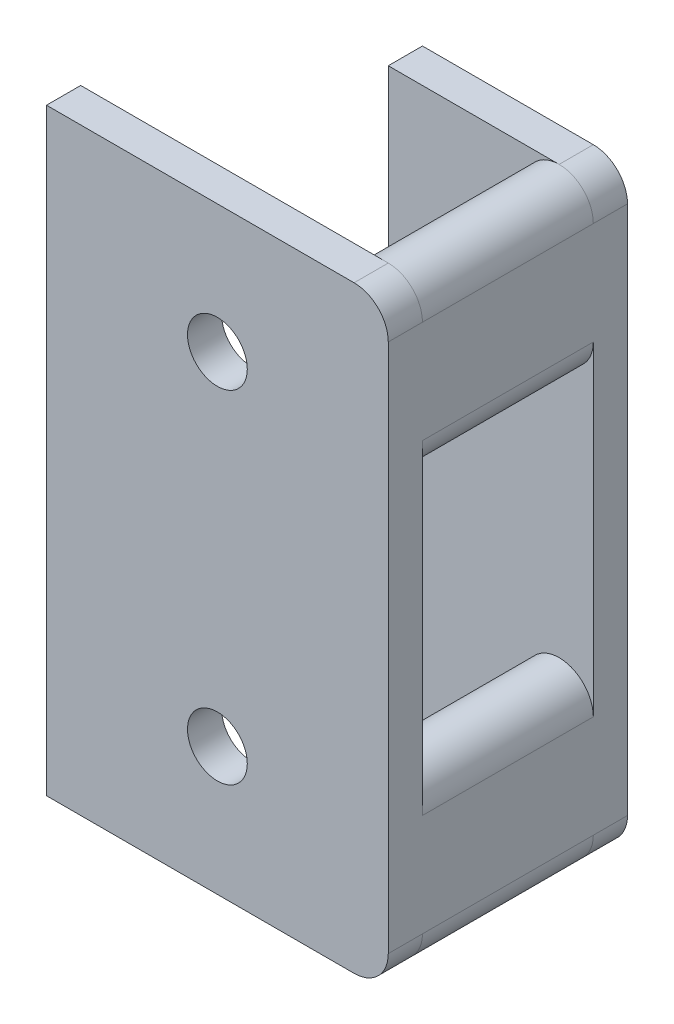
ISO-10303-21;
HEADER;
FILE_DESCRIPTION(('STEP AP214'),'2;1');
FILE_NAME('part.step','',(''),(''),'','','');
FILE_SCHEMA(('AUTOMOTIVE_DESIGN { 1 0 10303 214 1 1 1 1 }'));
ENDSEC;
DATA;
#1=APPLICATION_CONTEXT('core data for automotive mechanical design processes');
#2=APPLICATION_PROTOCOL_DEFINITION('international standard','automotive_design',2000,#1);
#3=PRODUCT_CONTEXT('',#1,'mechanical');
#4=PRODUCT('Part','Part','',(#3));
#5=PRODUCT_RELATED_PRODUCT_CATEGORY('part','',(#4));
#6=PRODUCT_DEFINITION_FORMATION('','',#4);
#7=PRODUCT_DEFINITION_CONTEXT('part definition',#1,'design');
#8=PRODUCT_DEFINITION('design','',#6,#7);
#9=PRODUCT_DEFINITION_SHAPE('','',#8);
#10=(LENGTH_UNIT() NAMED_UNIT(*) SI_UNIT(.MILLI.,.METRE.));
#11=(NAMED_UNIT(*) PLANE_ANGLE_UNIT() SI_UNIT($,.RADIAN.));
#12=(NAMED_UNIT(*) SI_UNIT($,.STERADIAN.) SOLID_ANGLE_UNIT());
#13=UNCERTAINTY_MEASURE_WITH_UNIT(LENGTH_MEASURE(1.E-05),#10,'distance_accuracy_value','');
#14=(GEOMETRIC_REPRESENTATION_CONTEXT(3) GLOBAL_UNCERTAINTY_ASSIGNED_CONTEXT((#13)) GLOBAL_UNIT_ASSIGNED_CONTEXT((#10,
#11,#12)) REPRESENTATION_CONTEXT('',''));
#15=CARTESIAN_POINT('',(0.,0.,0.));
#16=DIRECTION('',(0.,0.,1.));
#17=DIRECTION('',(1.,0.,0.));
#18=AXIS2_PLACEMENT_3D('',#15,#16,#17);
#19=CARTESIAN_POINT('',(0.,0.,-2.));
#20=DIRECTION('',(0.,0.,1.));
#21=DIRECTION('',(1.,0.,0.));
#22=AXIS2_PLACEMENT_3D('',#19,#20,#21);
#23=PLANE('',#22);
#24=CARTESIAN_POINT('',(-6.60245678525012,30.2958382318298,-2.));
#25=DIRECTION('',(0.,0.,1.));
#26=DIRECTION('',(1.,0.,0.));
#27=AXIS2_PLACEMENT_3D('',#24,#25,#26);
#28=CIRCLE('',#27,1.75);
#29=CARTESIAN_POINT('',(-4.85245678525012,30.2958382318298,-2.));
#30=VERTEX_POINT('',#29);
#31=EDGE_CURVE('E268',#30,#30,#28,.T.);
#32=ORIENTED_EDGE('',*,*,#31,.T.);
#33=EDGE_LOOP('',(#32));
#34=FACE_BOUND('',#33,.T.);
#35=CARTESIAN_POINT('',(-6.60245678525012,10.2958382318298,-2.));
#36=DIRECTION('',(0.,0.,1.));
#37=DIRECTION('',(1.,0.,0.));
#38=AXIS2_PLACEMENT_3D('',#35,#36,#37);
#39=CIRCLE('',#38,1.75);
#40=CARTESIAN_POINT('',(-4.85245678525012,10.2958382318298,-2.));
#41=VERTEX_POINT('',#40);
#42=EDGE_CURVE('E262',#41,#41,#39,.T.);
#43=ORIENTED_EDGE('',*,*,#42,.T.);
#44=EDGE_LOOP('',(#43));
#45=FACE_BOUND('',#44,.T.);
#46=CARTESIAN_POINT('',(1.39754321474987,4.79583823182983,-2.));
#47=DIRECTION('',(0.,0.,1.));
#48=DIRECTION('',(1.,0.,0.));
#49=AXIS2_PLACEMENT_3D('',#46,#47,#48);
#50=CIRCLE('',#49,2.);
#51=CARTESIAN_POINT('',(1.39754321474987,2.79583823182983,-2.));
#52=VERTEX_POINT('',#51);
#53=CARTESIAN_POINT('',(-0.60245678525013,4.79583823182983,-2.));
#54=VERTEX_POINT('',#53);
#55=EDGE_CURVE('E299',#52,#54,#50,.F.);
#56=ORIENTED_EDGE('',*,*,#55,.F.);
#57=DIRECTION('',(1.,0.,0.));
#58=VECTOR('',#57,1.);
#59=CARTESIAN_POINT('',(3.39754321474988,2.79583823182982,-2.));
#60=LINE('',#59,#58);
#61=CARTESIAN_POINT('',(-16.6024567852501,2.79583823182982,-2.));
#62=VERTEX_POINT('',#61);
#63=EDGE_CURVE('E282',#62,#52,#60,.T.);
#64=ORIENTED_EDGE('',*,*,#63,.F.);
#65=DIRECTION('',(0.,-1.,0.));
#66=VECTOR('',#65,1.);
#67=CARTESIAN_POINT('',(-16.6024567852501,2.79583823182982,-2.));
#68=LINE('',#67,#66);
#69=CARTESIAN_POINT('',(-16.6024567852501,37.7958382318298,-2.));
#70=VERTEX_POINT('',#69);
#71=EDGE_CURVE('E279',#70,#62,#68,.T.);
#72=ORIENTED_EDGE('',*,*,#71,.F.);
#73=DIRECTION('',(-1.,0.,0.));
#74=VECTOR('',#73,1.);
#75=CARTESIAN_POINT('',(3.39754321474988,37.7958382318298,-2.));
#76=LINE('',#75,#74);
#77=CARTESIAN_POINT('',(1.39754321474987,37.7958382318298,-2.));
#78=VERTEX_POINT('',#77);
#79=EDGE_CURVE('E276',#78,#70,#76,.T.);
#80=ORIENTED_EDGE('',*,*,#79,.F.);
#81=CARTESIAN_POINT('',(1.39754321474987,35.7958382318298,-2.));
#82=DIRECTION('',(0.,0.,-1.));
#83=DIRECTION('',(-1.,0.,0.));
#84=AXIS2_PLACEMENT_3D('',#81,#82,#83);
#85=CIRCLE('',#84,2.);
#86=CARTESIAN_POINT('',(-0.60245678525013,35.7958382318298,-2.));
#87=VERTEX_POINT('',#86);
#88=EDGE_CURVE('E223',#87,#78,#85,.T.);
#89=ORIENTED_EDGE('',*,*,#88,.F.);
#90=DIRECTION('',(0.,1.,0.));
#91=VECTOR('',#90,1.);
#92=CARTESIAN_POINT('',(-0.60245678525013,35.7958382318298,-2.));
#93=LINE('',#92,#91);
#94=CARTESIAN_POINT('',(-0.602456785250132,29.7958382318298,-2.));
#95=VERTEX_POINT('',#94);
#96=EDGE_CURVE('E235',#95,#87,#93,.T.);
#97=ORIENTED_EDGE('',*,*,#96,.F.);
#98=CARTESIAN_POINT('',(1.39754321474987,29.7958382318298,-2.));
#99=DIRECTION('',(0.,0.,-1.));
#100=DIRECTION('',(-1.,0.,0.));
#101=AXIS2_PLACEMENT_3D('',#98,#99,#100);
#102=CIRCLE('',#101,2.);
#103=CARTESIAN_POINT('',(3.39754321474988,29.7958382318298,-2.));
#104=VERTEX_POINT('',#103);
#105=EDGE_CURVE('E244',#104,#95,#102,.T.);
#106=ORIENTED_EDGE('',*,*,#105,.F.);
#107=DIRECTION('',(0.,1.,0.));
#108=VECTOR('',#107,1.);
#109=CARTESIAN_POINT('',(3.39754321474988,2.79583823182982,-2.));
#110=LINE('',#109,#108);
#111=CARTESIAN_POINT('',(3.39754321474988,10.7958382318298,-2.));
#112=VERTEX_POINT('',#111);
#113=EDGE_CURVE('E274',#112,#104,#110,.T.);
#114=ORIENTED_EDGE('',*,*,#113,.F.);
#115=CARTESIAN_POINT('',(1.39754321474987,10.7958382318298,-2.));
#116=DIRECTION('',(0.,0.,-1.));
#117=DIRECTION('',(1.,0.,0.));
#118=AXIS2_PLACEMENT_3D('',#115,#116,#117);
#119=CIRCLE('',#118,2.);
#120=CARTESIAN_POINT('',(-0.602456785250132,10.7958382318298,-2.));
#121=VERTEX_POINT('',#120);
#122=EDGE_CURVE('E215',#121,#112,#119,.T.);
#123=ORIENTED_EDGE('',*,*,#122,.F.);
#124=DIRECTION('',(0.,1.,0.));
#125=VECTOR('',#124,1.);
#126=CARTESIAN_POINT('',(-0.60245678525013,4.79583823182983,-2.));
#127=LINE('',#126,#125);
#128=EDGE_CURVE('E218',#54,#121,#127,.T.);
#129=ORIENTED_EDGE('',*,*,#128,.F.);
#130=EDGE_LOOP('',(#56,#64,#72,#80,#89,#97,#106,#114,#123,#129));
#131=FACE_BOUND('',#130,.T.);
#132=ADVANCED_FACE('F41',(#34,#45,#131),#23,.F.);
#133=CARTESIAN_POINT('',(3.39754321474988,2.79583823182982,-2.));
#134=DIRECTION('',(1.,0.,0.));
#135=DIRECTION('',(0.,0.,-1.));
#136=AXIS2_PLACEMENT_3D('',#133,#134,#135);
#137=PLANE('',#136);
#138=DIRECTION('',(0.,0.,1.));
#139=VECTOR('',#138,1.);
#140=CARTESIAN_POINT('',(3.39754321474986,29.7958382318298,-12.));
#141=LINE('',#140,#139);
#142=CARTESIAN_POINT('',(3.39754321474988,29.7958382318298,-12.));
#143=VERTEX_POINT('',#142);
#144=EDGE_CURVE('E255',#143,#104,#141,.T.);
#145=ORIENTED_EDGE('',*,*,#144,.F.);
#146=DIRECTION('',(0.,-1.,0.));
#147=VECTOR('',#146,1.);
#148=CARTESIAN_POINT('',(3.39754321474988,37.7958382318298,-12.));
#149=LINE('',#148,#147);
#150=CARTESIAN_POINT('',(3.39754321474986,10.7958382318298,-12.));
#151=VERTEX_POINT('',#150);
#152=EDGE_CURVE('E193',#143,#151,#149,.T.);
#153=ORIENTED_EDGE('',*,*,#152,.T.);
#154=DIRECTION('',(0.,0.,1.));
#155=VECTOR('',#154,1.);
#156=CARTESIAN_POINT('',(3.39754321474986,10.7958382318298,-12.));
#157=LINE('',#156,#155);
#158=EDGE_CURVE('E209',#151,#112,#157,.T.);
#159=ORIENTED_EDGE('',*,*,#158,.T.);
#160=ORIENTED_EDGE('',*,*,#113,.T.);
#161=EDGE_LOOP('',(#145,#153,#159,#160));
#162=FACE_BOUND('',#161,.T.);
#163=DIRECTION('',(0.,1.,0.));
#164=VECTOR('',#163,1.);
#165=CARTESIAN_POINT('',(3.39754321474988,2.79583823182982,0.));
#166=LINE('',#165,#164);
#167=CARTESIAN_POINT('',(3.39754321474988,4.79583823182982,0.));
#168=VERTEX_POINT('',#167);
#169=CARTESIAN_POINT('',(3.39754321474988,35.7958382318298,0.));
#170=VERTEX_POINT('',#169);
#171=EDGE_CURVE('E271',#168,#170,#166,.T.);
#172=ORIENTED_EDGE('',*,*,#171,.F.);
#173=DIRECTION('',(0.,0.,1.));
#174=VECTOR('',#173,1.);
#175=CARTESIAN_POINT('',(3.39754321474988,4.79583823182982,-2.));
#176=LINE('',#175,#174);
#177=CARTESIAN_POINT('',(3.39754321474986,4.79583823182983,-2.));
#178=VERTEX_POINT('',#177);
#179=EDGE_CURVE('E316',#168,#178,#176,.F.);
#180=ORIENTED_EDGE('',*,*,#179,.T.);
#181=DIRECTION('',(0.,0.,1.));
#182=VECTOR('',#181,1.);
#183=CARTESIAN_POINT('',(3.39754321474986,4.79583823182983,-12.));
#184=LINE('',#183,#182);
#185=CARTESIAN_POINT('',(3.39754321474988,4.79583823182983,-12.));
#186=VERTEX_POINT('',#185);
#187=EDGE_CURVE('E211',#186,#178,#184,.T.);
#188=ORIENTED_EDGE('',*,*,#187,.F.);
#189=DIRECTION('',(0.,0.,1.));
#190=VECTOR('',#189,1.);
#191=CARTESIAN_POINT('',(3.39754321474988,4.79583823182982,-14.));
#192=LINE('',#191,#190);
#193=CARTESIAN_POINT('',(3.39754321474988,4.79583823182982,-14.));
#194=VERTEX_POINT('',#193);
#195=EDGE_CURVE('E311',#186,#194,#192,.F.);
#196=ORIENTED_EDGE('',*,*,#195,.T.);
#197=DIRECTION('',(0.,-1.,0.));
#198=VECTOR('',#197,1.);
#199=CARTESIAN_POINT('',(3.39754321474988,37.7958382318298,-14.));
#200=LINE('',#199,#198);
#201=CARTESIAN_POINT('',(3.39754321474988,35.7958382318298,-14.));
#202=VERTEX_POINT('',#201);
#203=EDGE_CURVE('E174',#202,#194,#200,.T.);
#204=ORIENTED_EDGE('',*,*,#203,.F.);
#205=DIRECTION('',(0.,0.,1.));
#206=VECTOR('',#205,1.);
#207=CARTESIAN_POINT('',(3.39754321474988,35.7958382318298,-12.));
#208=LINE('',#207,#206);
#209=CARTESIAN_POINT('',(3.39754321474986,35.7958382318298,-12.));
#210=VERTEX_POINT('',#209);
#211=EDGE_CURVE('E313',#202,#210,#208,.T.);
#212=ORIENTED_EDGE('',*,*,#211,.T.);
#213=DIRECTION('',(0.,0.,1.));
#214=VECTOR('',#213,1.);
#215=CARTESIAN_POINT('',(3.39754321474986,35.7958382318298,-12.));
#216=LINE('',#215,#214);
#217=CARTESIAN_POINT('',(3.39754321474988,35.7958382318298,-2.));
#218=VERTEX_POINT('',#217);
#219=EDGE_CURVE('E258',#210,#218,#216,.T.);
#220=ORIENTED_EDGE('',*,*,#219,.T.);
#221=DIRECTION('',(0.,0.,1.));
#222=VECTOR('',#221,1.);
#223=CARTESIAN_POINT('',(3.39754321474988,35.7958382318298,-2.));
#224=LINE('',#223,#222);
#225=EDGE_CURVE('E308',#218,#170,#224,.T.);
#226=ORIENTED_EDGE('',*,*,#225,.T.);
#227=EDGE_LOOP('',(#172,#180,#188,#196,#204,#212,#220,#226));
#228=FACE_BOUND('',#227,.T.);
#229=ADVANCED_FACE('F340',(#162,#228),#137,.T.);
#230=CARTESIAN_POINT('',(3.39754321474988,2.79583823182982,-2.));
#231=DIRECTION('',(0.,-1.,0.));
#232=DIRECTION('',(1.,0.,0.));
#233=AXIS2_PLACEMENT_3D('',#230,#231,#232);
#234=PLANE('',#233);
#235=ORIENTED_EDGE('',*,*,#63,.T.);
#236=DIRECTION('',(0.,0.,1.));
#237=VECTOR('',#236,1.);
#238=CARTESIAN_POINT('',(1.39754321474988,2.79583823182982,-2.));
#239=LINE('',#238,#237);
#240=CARTESIAN_POINT('',(1.39754321474988,2.79583823182982,0.));
#241=VERTEX_POINT('',#240);
#242=EDGE_CURVE('E301',#52,#241,#239,.T.);
#243=ORIENTED_EDGE('',*,*,#242,.T.);
#244=DIRECTION('',(1.,0.,0.));
#245=VECTOR('',#244,1.);
#246=CARTESIAN_POINT('',(3.39754321474988,2.79583823182982,0.));
#247=LINE('',#246,#245);
#248=CARTESIAN_POINT('',(-16.6024567852501,2.79583823182982,0.));
#249=VERTEX_POINT('',#248);
#250=EDGE_CURVE('E277',#249,#241,#247,.T.);
#251=ORIENTED_EDGE('',*,*,#250,.F.);
#252=DIRECTION('',(0.,0.,1.));
#253=VECTOR('',#252,1.);
#254=CARTESIAN_POINT('',(-16.6024567852501,2.79583823182982,-2.));
#255=LINE('',#254,#253);
#256=EDGE_CURVE('E295',#62,#249,#255,.T.);
#257=ORIENTED_EDGE('',*,*,#256,.F.);
#258=EDGE_LOOP('',(#235,#243,#251,#257));
#259=FACE_BOUND('',#258,.T.);
#260=ADVANCED_FACE('F358',(#259),#234,.T.);
#261=CARTESIAN_POINT('',(-16.6024567852501,2.79583823182982,-2.));
#262=DIRECTION('',(-1.,0.,0.));
#263=DIRECTION('',(0.,0.,1.));
#264=AXIS2_PLACEMENT_3D('',#261,#262,#263);
#265=PLANE('',#264);
#266=DIRECTION('',(0.,-1.,0.));
#267=VECTOR('',#266,1.);
#268=CARTESIAN_POINT('',(-16.6024567852501,2.79583823182982,0.));
#269=LINE('',#268,#267);
#270=CARTESIAN_POINT('',(-16.6024567852501,37.7958382318298,0.));
#271=VERTEX_POINT('',#270);
#272=EDGE_CURVE('E290',#271,#249,#269,.T.);
#273=ORIENTED_EDGE('',*,*,#272,.F.);
#274=DIRECTION('',(0.,0.,1.));
#275=VECTOR('',#274,1.);
#276=CARTESIAN_POINT('',(-16.6024567852501,37.7958382318298,-2.));
#277=LINE('',#276,#275);
#278=EDGE_CURVE('E285',#70,#271,#277,.T.);
#279=ORIENTED_EDGE('',*,*,#278,.F.);
#280=ORIENTED_EDGE('',*,*,#71,.T.);
#281=ORIENTED_EDGE('',*,*,#256,.T.);
#282=EDGE_LOOP('',(#273,#279,#280,#281));
#283=FACE_BOUND('',#282,.T.);
#284=ADVANCED_FACE('F385',(#283),#265,.T.);
#285=CARTESIAN_POINT('',(3.39754321474988,37.7958382318298,-2.));
#286=DIRECTION('',(0.,1.,0.));
#287=DIRECTION('',(-1.,0.,0.));
#288=AXIS2_PLACEMENT_3D('',#285,#286,#287);
#289=PLANE('',#288);
#290=DIRECTION('',(-1.,0.,0.));
#291=VECTOR('',#290,1.);
#292=CARTESIAN_POINT('',(3.39754321474988,37.7958382318298,0.));
#293=LINE('',#292,#291);
#294=CARTESIAN_POINT('',(1.39754321474988,37.7958382318298,0.));
#295=VERTEX_POINT('',#294);
#296=EDGE_CURVE('E288',#295,#271,#293,.T.);
#297=ORIENTED_EDGE('',*,*,#296,.F.);
#298=DIRECTION('',(0.,0.,1.));
#299=VECTOR('',#298,1.);
#300=CARTESIAN_POINT('',(1.39754321474988,37.7958382318298,-2.));
#301=LINE('',#300,#299);
#302=EDGE_CURVE('E11',#295,#78,#301,.F.);
#303=ORIENTED_EDGE('',*,*,#302,.T.);
#304=ORIENTED_EDGE('',*,*,#79,.T.);
#305=ORIENTED_EDGE('',*,*,#278,.T.);
#306=EDGE_LOOP('',(#297,#303,#304,#305));
#307=FACE_BOUND('',#306,.T.);
#308=ADVANCED_FACE('F382',(#307),#289,.T.);
#309=CARTESIAN_POINT('',(0.,0.,0.));
#310=DIRECTION('',(0.,0.,1.));
#311=DIRECTION('',(1.,0.,0.));
#312=AXIS2_PLACEMENT_3D('',#309,#310,#311);
#313=PLANE('',#312);
#314=CARTESIAN_POINT('',(-6.60245678525012,10.2958382318298,0.));
#315=DIRECTION('',(0.,0.,1.));
#316=DIRECTION('',(1.,0.,0.));
#317=AXIS2_PLACEMENT_3D('',#314,#315,#316);
#318=CIRCLE('',#317,1.75);
#319=CARTESIAN_POINT('',(-4.85245678525012,10.2958382318298,0.));
#320=VERTEX_POINT('',#319);
#321=EDGE_CURVE('E261',#320,#320,#318,.T.);
#322=ORIENTED_EDGE('',*,*,#321,.F.);
#323=EDGE_LOOP('',(#322));
#324=FACE_BOUND('',#323,.T.);
#325=CARTESIAN_POINT('',(-6.60245678525012,30.2958382318298,0.));
#326=DIRECTION('',(0.,0.,1.));
#327=DIRECTION('',(1.,0.,0.));
#328=AXIS2_PLACEMENT_3D('',#325,#326,#327);
#329=CIRCLE('',#328,1.75);
#330=CARTESIAN_POINT('',(-4.85245678525012,30.2958382318298,0.));
#331=VERTEX_POINT('',#330);
#332=EDGE_CURVE('E265',#331,#331,#329,.T.);
#333=ORIENTED_EDGE('',*,*,#332,.F.);
#334=EDGE_LOOP('',(#333));
#335=FACE_BOUND('',#334,.T.);
#336=ORIENTED_EDGE('',*,*,#250,.T.);
#337=CARTESIAN_POINT('',(1.39754321474988,4.79583823182982,0.));
#338=DIRECTION('',(0.,0.,1.));
#339=DIRECTION('',(1.,0.,0.));
#340=AXIS2_PLACEMENT_3D('',#337,#338,#339);
#341=CIRCLE('',#340,2.);
#342=EDGE_CURVE('E306',#241,#168,#341,.T.);
#343=ORIENTED_EDGE('',*,*,#342,.T.);
#344=ORIENTED_EDGE('',*,*,#171,.T.);
#345=CARTESIAN_POINT('',(1.39754321474988,35.7958382318298,0.));
#346=DIRECTION('',(0.,0.,1.));
#347=DIRECTION('',(1.,0.,0.));
#348=AXIS2_PLACEMENT_3D('',#345,#346,#347);
#349=CIRCLE('',#348,2.);
#350=EDGE_CURVE('E304',#170,#295,#349,.T.);
#351=ORIENTED_EDGE('',*,*,#350,.T.);
#352=ORIENTED_EDGE('',*,*,#296,.T.);
#353=ORIENTED_EDGE('',*,*,#272,.T.);
#354=EDGE_LOOP('',(#336,#343,#344,#351,#352,#353));
#355=FACE_BOUND('',#354,.T.);
#356=ADVANCED_FACE('F350',(#324,#335,#355),#313,.T.);
#357=CARTESIAN_POINT('',(-6.60245678525012,30.2958382318298,-2.));
#358=DIRECTION('',(0.,0.,1.));
#359=DIRECTION('',(1.,0.,0.));
#360=AXIS2_PLACEMENT_3D('',#357,#358,#359);
#361=CYLINDRICAL_SURFACE('',#360,1.75);
#362=ORIENTED_EDGE('',*,*,#31,.F.);
#363=EDGE_LOOP('',(#362));
#364=FACE_BOUND('',#363,.T.);
#365=ORIENTED_EDGE('',*,*,#332,.T.);
#366=EDGE_LOOP('',(#365));
#367=FACE_BOUND('',#366,.T.);
#368=ADVANCED_FACE('F406',(#364,#367),#361,.F.);
#369=CARTESIAN_POINT('',(-6.60245678525012,10.2958382318298,-2.));
#370=DIRECTION('',(0.,0.,1.));
#371=DIRECTION('',(1.,0.,0.));
#372=AXIS2_PLACEMENT_3D('',#369,#370,#371);
#373=CYLINDRICAL_SURFACE('',#372,1.75);
#374=ORIENTED_EDGE('',*,*,#42,.F.);
#375=EDGE_LOOP('',(#374));
#376=FACE_BOUND('',#375,.T.);
#377=ORIENTED_EDGE('',*,*,#321,.T.);
#378=EDGE_LOOP('',(#377));
#379=FACE_BOUND('',#378,.T.);
#380=ADVANCED_FACE('F413',(#376,#379),#373,.F.);
#381=CARTESIAN_POINT('',(1.39754321474987,35.7958382318298,-12.));
#382=DIRECTION('',(0.,0.,1.));
#383=DIRECTION('',(1.,0.,0.));
#384=AXIS2_PLACEMENT_3D('',#381,#382,#383);
#385=CYLINDRICAL_SURFACE('',#384,2.);
#386=ORIENTED_EDGE('',*,*,#88,.T.);
#387=EDGE_CURVE('E245',#78,#218,#85,.T.);
#388=ORIENTED_EDGE('',*,*,#387,.T.);
#389=ORIENTED_EDGE('',*,*,#219,.F.);
#390=CARTESIAN_POINT('',(1.39754321474987,35.7958382318298,-12.));
#391=DIRECTION('',(0.,0.,-1.));
#392=DIRECTION('',(-1.,0.,0.));
#393=AXIS2_PLACEMENT_3D('',#390,#391,#392);
#394=CIRCLE('',#393,2.);
#395=CARTESIAN_POINT('',(1.39754321474987,37.7958382318298,-12.));
#396=VERTEX_POINT('',#395);
#397=EDGE_CURVE('E183',#396,#210,#394,.T.);
#398=ORIENTED_EDGE('',*,*,#397,.F.);
#399=CARTESIAN_POINT('',(1.39754321474987,35.7958382318298,-12.));
#400=DIRECTION('',(0.,0.,-1.));
#401=DIRECTION('',(-1.,0.,0.));
#402=AXIS2_PLACEMENT_3D('',#399,#400,#401);
#403=CIRCLE('',#402,2.);
#404=CARTESIAN_POINT('',(-0.60245678525013,35.7958382318298,-12.));
#405=VERTEX_POINT('',#404);
#406=EDGE_CURVE('E231',#405,#396,#403,.T.);
#407=ORIENTED_EDGE('',*,*,#406,.F.);
#408=DIRECTION('',(0.,0.,1.));
#409=VECTOR('',#408,1.);
#410=CARTESIAN_POINT('',(-0.60245678525013,35.7958382318298,-12.));
#411=LINE('',#410,#409);
#412=EDGE_CURVE('E241',#405,#87,#411,.T.);
#413=ORIENTED_EDGE('',*,*,#412,.T.);
#414=EDGE_LOOP('',(#386,#388,#389,#398,#407,#413));
#415=FACE_BOUND('',#414,.T.);
#416=ADVANCED_FACE('F343',(#415),#385,.T.);
#417=CARTESIAN_POINT('',(1.39754321474987,29.7958382318298,-12.));
#418=DIRECTION('',(0.,0.,1.));
#419=DIRECTION('',(1.,0.,0.));
#420=AXIS2_PLACEMENT_3D('',#417,#418,#419);
#421=CYLINDRICAL_SURFACE('',#420,2.);
#422=ORIENTED_EDGE('',*,*,#105,.T.);
#423=DIRECTION('',(0.,0.,1.));
#424=VECTOR('',#423,1.);
#425=CARTESIAN_POINT('',(-0.602456785250132,29.7958382318298,-12.));
#426=LINE('',#425,#424);
#427=CARTESIAN_POINT('',(-0.602456785250132,29.7958382318298,-12.));
#428=VERTEX_POINT('',#427);
#429=EDGE_CURVE('E252',#428,#95,#426,.T.);
#430=ORIENTED_EDGE('',*,*,#429,.F.);
#431=CARTESIAN_POINT('',(1.39754321474987,29.7958382318298,-12.));
#432=DIRECTION('',(0.,0.,-1.));
#433=DIRECTION('',(-1.,0.,0.));
#434=AXIS2_PLACEMENT_3D('',#431,#432,#433);
#435=CIRCLE('',#434,2.);
#436=EDGE_CURVE('E234',#143,#428,#435,.T.);
#437=ORIENTED_EDGE('',*,*,#436,.F.);
#438=ORIENTED_EDGE('',*,*,#144,.T.);
#439=EDGE_LOOP('',(#422,#430,#437,#438));
#440=FACE_BOUND('',#439,.T.);
#441=ADVANCED_FACE('F376',(#440),#421,.T.);
#442=CARTESIAN_POINT('',(-0.60245678525013,35.7958382318298,-12.));
#443=DIRECTION('',(1.,0.,0.));
#444=DIRECTION('',(0.,1.,0.));
#445=AXIS2_PLACEMENT_3D('',#442,#443,#444);
#446=PLANE('',#445);
#447=ORIENTED_EDGE('',*,*,#96,.T.);
#448=ORIENTED_EDGE('',*,*,#412,.F.);
#449=DIRECTION('',(0.,1.,0.));
#450=VECTOR('',#449,1.);
#451=CARTESIAN_POINT('',(-0.60245678525013,35.7958382318298,-12.));
#452=LINE('',#451,#450);
#453=EDGE_CURVE('E238',#428,#405,#452,.T.);
#454=ORIENTED_EDGE('',*,*,#453,.F.);
#455=ORIENTED_EDGE('',*,*,#429,.T.);
#456=EDGE_LOOP('',(#447,#448,#454,#455));
#457=FACE_BOUND('',#456,.T.);
#458=ADVANCED_FACE('F379',(#457),#446,.F.);
#459=CARTESIAN_POINT('',(1.39754321474987,4.79583823182983,-12.));
#460=DIRECTION('',(0.,0.,1.));
#461=DIRECTION('',(1.,0.,0.));
#462=AXIS2_PLACEMENT_3D('',#459,#460,#461);
#463=CYLINDRICAL_SURFACE('',#462,2.);
#464=CARTESIAN_POINT('',(1.39754321474987,4.79583823182983,-2.));
#465=DIRECTION('',(0.,0.,-1.));
#466=DIRECTION('',(1.,0.,0.));
#467=AXIS2_PLACEMENT_3D('',#464,#465,#466);
#468=CIRCLE('',#467,2.);
#469=EDGE_CURVE('E221',#178,#52,#468,.T.);
#470=ORIENTED_EDGE('',*,*,#469,.T.);
#471=ORIENTED_EDGE('',*,*,#55,.T.);
#472=DIRECTION('',(0.,0.,1.));
#473=VECTOR('',#472,1.);
#474=CARTESIAN_POINT('',(-0.60245678525013,4.79583823182983,-12.));
#475=LINE('',#474,#473);
#476=CARTESIAN_POINT('',(-0.60245678525013,4.79583823182983,-12.));
#477=VERTEX_POINT('',#476);
#478=EDGE_CURVE('E203',#477,#54,#475,.T.);
#479=ORIENTED_EDGE('',*,*,#478,.F.);
#480=CARTESIAN_POINT('',(1.39754321474987,4.79583823182983,-12.));
#481=DIRECTION('',(0.,0.,-1.));
#482=DIRECTION('',(1.,0.,0.));
#483=AXIS2_PLACEMENT_3D('',#480,#481,#482);
#484=CIRCLE('',#483,2.);
#485=CARTESIAN_POINT('',(1.39754321474987,2.79583823182982,-12.));
#486=VERTEX_POINT('',#485);
#487=EDGE_CURVE('E229',#486,#477,#484,.T.);
#488=ORIENTED_EDGE('',*,*,#487,.F.);
#489=EDGE_CURVE('E219',#186,#486,#484,.T.);
#490=ORIENTED_EDGE('',*,*,#489,.F.);
#491=ORIENTED_EDGE('',*,*,#187,.T.);
#492=EDGE_LOOP('',(#470,#471,#479,#488,#490,#491));
#493=FACE_BOUND('',#492,.T.);
#494=ADVANCED_FACE('F326',(#493),#463,.T.);
#495=CARTESIAN_POINT('',(-0.60245678525013,4.79583823182983,-12.));
#496=DIRECTION('',(1.,0.,0.));
#497=DIRECTION('',(0.,1.,0.));
#498=AXIS2_PLACEMENT_3D('',#495,#496,#497);
#499=PLANE('',#498);
#500=ORIENTED_EDGE('',*,*,#128,.T.);
#501=DIRECTION('',(0.,0.,1.));
#502=VECTOR('',#501,1.);
#503=CARTESIAN_POINT('',(-0.602456785250132,10.7958382318298,-12.));
#504=LINE('',#503,#502);
#505=CARTESIAN_POINT('',(-0.602456785250132,10.7958382318298,-12.));
#506=VERTEX_POINT('',#505);
#507=EDGE_CURVE('E206',#506,#121,#504,.T.);
#508=ORIENTED_EDGE('',*,*,#507,.F.);
#509=DIRECTION('',(0.,1.,0.));
#510=VECTOR('',#509,1.);
#511=CARTESIAN_POINT('',(-0.60245678525013,4.79583823182983,-12.));
#512=LINE('',#511,#510);
#513=EDGE_CURVE('E226',#477,#506,#512,.T.);
#514=ORIENTED_EDGE('',*,*,#513,.F.);
#515=ORIENTED_EDGE('',*,*,#478,.T.);
#516=EDGE_LOOP('',(#500,#508,#514,#515));
#517=FACE_BOUND('',#516,.T.);
#518=ADVANCED_FACE('F367',(#517),#499,.F.);
#519=CARTESIAN_POINT('',(1.39754321474987,10.7958382318298,-12.));
#520=DIRECTION('',(0.,0.,1.));
#521=DIRECTION('',(1.,0.,0.));
#522=AXIS2_PLACEMENT_3D('',#519,#520,#521);
#523=CYLINDRICAL_SURFACE('',#522,2.);
#524=ORIENTED_EDGE('',*,*,#122,.T.);
#525=ORIENTED_EDGE('',*,*,#158,.F.);
#526=CARTESIAN_POINT('',(1.39754321474987,10.7958382318298,-12.));
#527=DIRECTION('',(0.,0.,-1.));
#528=DIRECTION('',(1.,0.,0.));
#529=AXIS2_PLACEMENT_3D('',#526,#527,#528);
#530=CIRCLE('',#529,2.);
#531=EDGE_CURVE('E214',#506,#151,#530,.T.);
#532=ORIENTED_EDGE('',*,*,#531,.F.);
#533=ORIENTED_EDGE('',*,*,#507,.T.);
#534=EDGE_LOOP('',(#524,#525,#532,#533));
#535=FACE_BOUND('',#534,.T.);
#536=ADVANCED_FACE('F431',(#535),#523,.T.);
#537=CARTESIAN_POINT('',(3.39754321474988,2.79583823182982,-14.));
#538=DIRECTION('',(0.,1.,0.));
#539=DIRECTION('',(0.,0.,1.));
#540=AXIS2_PLACEMENT_3D('',#537,#538,#539);
#541=PLANE('',#540);
#542=DIRECTION('',(-1.,0.,0.));
#543=VECTOR('',#542,1.);
#544=CARTESIAN_POINT('',(3.39754321474988,2.79583823182982,-14.));
#545=LINE('',#544,#543);
#546=CARTESIAN_POINT('',(1.39754321474988,2.79583823182982,-14.));
#547=VERTEX_POINT('',#546);
#548=CARTESIAN_POINT('',(-8.60245678525012,2.79583823182982,-14.));
#549=VERTEX_POINT('',#548);
#550=EDGE_CURVE('E165',#547,#549,#545,.T.);
#551=ORIENTED_EDGE('',*,*,#550,.F.);
#552=DIRECTION('',(0.,0.,1.));
#553=VECTOR('',#552,1.);
#554=CARTESIAN_POINT('',(1.39754321474988,2.79583823182982,-12.));
#555=LINE('',#554,#553);
#556=EDGE_CURVE('E49',#547,#486,#555,.T.);
#557=ORIENTED_EDGE('',*,*,#556,.T.);
#558=DIRECTION('',(-1.,0.,0.));
#559=VECTOR('',#558,1.);
#560=CARTESIAN_POINT('',(3.39754321474988,2.79583823182982,-12.));
#561=LINE('',#560,#559);
#562=CARTESIAN_POINT('',(-8.60245678525012,2.79583823182982,-12.));
#563=VERTEX_POINT('',#562);
#564=EDGE_CURVE('E180',#486,#563,#561,.T.);
#565=ORIENTED_EDGE('',*,*,#564,.T.);
#566=DIRECTION('',(0.,0.,1.));
#567=VECTOR('',#566,1.);
#568=CARTESIAN_POINT('',(-8.60245678525012,2.79583823182982,-14.));
#569=LINE('',#568,#567);
#570=EDGE_CURVE('E177',#549,#563,#569,.T.);
#571=ORIENTED_EDGE('',*,*,#570,.F.);
#572=EDGE_LOOP('',(#551,#557,#565,#571));
#573=FACE_BOUND('',#572,.T.);
#574=ADVANCED_FACE('F178',(#573),#541,.F.);
#575=CARTESIAN_POINT('',(-8.60245678525012,37.7958382318298,-14.));
#576=DIRECTION('',(1.,0.,0.));
#577=DIRECTION('',(0.,1.,0.));
#578=AXIS2_PLACEMENT_3D('',#575,#576,#577);
#579=PLANE('',#578);
#580=DIRECTION('',(0.,1.,0.));
#581=VECTOR('',#580,1.);
#582=CARTESIAN_POINT('',(-8.60245678525012,37.7958382318298,-12.));
#583=LINE('',#582,#581);
#584=CARTESIAN_POINT('',(-8.60245678525012,37.7958382318298,-12.));
#585=VERTEX_POINT('',#584);
#586=EDGE_CURVE('E197',#563,#585,#583,.T.);
#587=ORIENTED_EDGE('',*,*,#586,.T.);
#588=DIRECTION('',(0.,0.,1.));
#589=VECTOR('',#588,1.);
#590=CARTESIAN_POINT('',(-8.60245678525012,37.7958382318298,-14.));
#591=LINE('',#590,#589);
#592=CARTESIAN_POINT('',(-8.60245678525012,37.7958382318298,-14.));
#593=VERTEX_POINT('',#592);
#594=EDGE_CURVE('E184',#593,#585,#591,.T.);
#595=ORIENTED_EDGE('',*,*,#594,.F.);
#596=DIRECTION('',(0.,1.,0.));
#597=VECTOR('',#596,1.);
#598=CARTESIAN_POINT('',(-8.60245678525012,37.7958382318298,-14.));
#599=LINE('',#598,#597);
#600=EDGE_CURVE('E169',#549,#593,#599,.T.);
#601=ORIENTED_EDGE('',*,*,#600,.F.);
#602=ORIENTED_EDGE('',*,*,#570,.T.);
#603=EDGE_LOOP('',(#587,#595,#601,#602));
#604=FACE_BOUND('',#603,.T.);
#605=ADVANCED_FACE('F186',(#604),#579,.F.);
#606=CARTESIAN_POINT('',(3.39754321474988,37.7958382318298,-14.));
#607=DIRECTION('',(0.,-1.,0.));
#608=DIRECTION('',(0.,0.,-1.));
#609=AXIS2_PLACEMENT_3D('',#606,#607,#608);
#610=PLANE('',#609);
#611=DIRECTION('',(1.,0.,0.));
#612=VECTOR('',#611,1.);
#613=CARTESIAN_POINT('',(3.39754321474988,37.7958382318298,-12.));
#614=LINE('',#613,#612);
#615=EDGE_CURVE('E199',#585,#396,#614,.T.);
#616=ORIENTED_EDGE('',*,*,#615,.T.);
#617=DIRECTION('',(0.,0.,1.));
#618=VECTOR('',#617,1.);
#619=CARTESIAN_POINT('',(1.39754321474988,37.7958382318298,-14.));
#620=LINE('',#619,#618);
#621=CARTESIAN_POINT('',(1.39754321474988,37.7958382318298,-14.));
#622=VERTEX_POINT('',#621);
#623=EDGE_CURVE('E64',#396,#622,#620,.F.);
#624=ORIENTED_EDGE('',*,*,#623,.T.);
#625=DIRECTION('',(1.,0.,0.));
#626=VECTOR('',#625,1.);
#627=CARTESIAN_POINT('',(3.39754321474988,37.7958382318298,-14.));
#628=LINE('',#627,#626);
#629=EDGE_CURVE('E188',#593,#622,#628,.T.);
#630=ORIENTED_EDGE('',*,*,#629,.F.);
#631=ORIENTED_EDGE('',*,*,#594,.T.);
#632=EDGE_LOOP('',(#616,#624,#630,#631));
#633=FACE_BOUND('',#632,.T.);
#634=ADVANCED_FACE('F331',(#633),#610,.F.);
#635=CARTESIAN_POINT('',(0.,0.,-14.));
#636=DIRECTION('',(0.,0.,-1.));
#637=DIRECTION('',(-1.,0.,0.));
#638=AXIS2_PLACEMENT_3D('',#635,#636,#637);
#639=PLANE('',#638);
#640=ORIENTED_EDGE('',*,*,#629,.T.);
#641=CARTESIAN_POINT('',(1.39754321474988,35.7958382318298,-14.));
#642=DIRECTION('',(0.,0.,-1.));
#643=DIRECTION('',(-1.,0.,0.));
#644=AXIS2_PLACEMENT_3D('',#641,#642,#643);
#645=CIRCLE('',#644,2.);
#646=EDGE_CURVE('E320',#622,#202,#645,.T.);
#647=ORIENTED_EDGE('',*,*,#646,.T.);
#648=ORIENTED_EDGE('',*,*,#203,.T.);
#649=CARTESIAN_POINT('',(1.39754321474988,4.79583823182982,-14.));
#650=DIRECTION('',(0.,0.,-1.));
#651=DIRECTION('',(-1.,0.,0.));
#652=AXIS2_PLACEMENT_3D('',#649,#650,#651);
#653=CIRCLE('',#652,2.);
#654=EDGE_CURVE('E56',#194,#547,#653,.T.);
#655=ORIENTED_EDGE('',*,*,#654,.T.);
#656=ORIENTED_EDGE('',*,*,#550,.T.);
#657=ORIENTED_EDGE('',*,*,#600,.T.);
#658=EDGE_LOOP('',(#640,#647,#648,#655,#656,#657));
#659=FACE_BOUND('',#658,.T.);
#660=ADVANCED_FACE('F167',(#659),#639,.T.);
#661=CARTESIAN_POINT('',(0.,0.,-12.));
#662=DIRECTION('',(0.,0.,-1.));
#663=DIRECTION('',(-1.,0.,0.));
#664=AXIS2_PLACEMENT_3D('',#661,#662,#663);
#665=PLANE('',#664);
#666=ORIENTED_EDGE('',*,*,#453,.T.);
#667=ORIENTED_EDGE('',*,*,#406,.T.);
#668=ORIENTED_EDGE('',*,*,#615,.F.);
#669=ORIENTED_EDGE('',*,*,#586,.F.);
#670=ORIENTED_EDGE('',*,*,#564,.F.);
#671=ORIENTED_EDGE('',*,*,#487,.T.);
#672=ORIENTED_EDGE('',*,*,#513,.T.);
#673=ORIENTED_EDGE('',*,*,#531,.T.);
#674=ORIENTED_EDGE('',*,*,#152,.F.);
#675=ORIENTED_EDGE('',*,*,#436,.T.);
#676=EDGE_LOOP('',(#666,#667,#668,#669,#670,#671,#672,#673,#674,#675));
#677=FACE_BOUND('',#676,.T.);
#678=ADVANCED_FACE('F329',(#677),#665,.F.);
#679=CARTESIAN_POINT('',(1.39754321474988,4.79583823182982,-2.));
#680=DIRECTION('',(0.,0.,1.));
#681=DIRECTION('',(1.,0.,0.));
#682=AXIS2_PLACEMENT_3D('',#679,#680,#681);
#683=CYLINDRICAL_SURFACE('',#682,2.);
#684=ORIENTED_EDGE('',*,*,#469,.F.);
#685=ORIENTED_EDGE('',*,*,#179,.F.);
#686=ORIENTED_EDGE('',*,*,#342,.F.);
#687=ORIENTED_EDGE('',*,*,#242,.F.);
#688=EDGE_LOOP('',(#684,#685,#686,#687));
#689=FACE_BOUND('',#688,.T.);
#690=ADVANCED_FACE('F356',(#689),#683,.T.);
#691=CARTESIAN_POINT('',(1.39754321474988,35.7958382318298,-2.));
#692=DIRECTION('',(0.,0.,-1.));
#693=DIRECTION('',(-1.,0.,0.));
#694=AXIS2_PLACEMENT_3D('',#691,#692,#693);
#695=CYLINDRICAL_SURFACE('',#694,2.);
#696=ORIENTED_EDGE('',*,*,#646,.F.);
#697=ORIENTED_EDGE('',*,*,#623,.F.);
#698=ORIENTED_EDGE('',*,*,#397,.T.);
#699=ORIENTED_EDGE('',*,*,#211,.F.);
#700=EDGE_LOOP('',(#696,#697,#698,#699));
#701=FACE_BOUND('',#700,.T.);
#702=ADVANCED_FACE('F336',(#701),#695,.T.);
#703=CARTESIAN_POINT('',(1.39754321474988,4.79583823182982,-14.));
#704=DIRECTION('',(0.,0.,-1.));
#705=DIRECTION('',(-1.,0.,0.));
#706=AXIS2_PLACEMENT_3D('',#703,#704,#705);
#707=CYLINDRICAL_SURFACE('',#706,2.);
#708=ORIENTED_EDGE('',*,*,#654,.F.);
#709=ORIENTED_EDGE('',*,*,#195,.F.);
#710=ORIENTED_EDGE('',*,*,#489,.T.);
#711=ORIENTED_EDGE('',*,*,#556,.F.);
#712=EDGE_LOOP('',(#708,#709,#710,#711));
#713=FACE_BOUND('',#712,.T.);
#714=ADVANCED_FACE('F469',(#713),#707,.T.);
#715=CARTESIAN_POINT('',(1.39754321474988,35.7958382318298,-2.));
#716=DIRECTION('',(0.,0.,1.));
#717=DIRECTION('',(1.,0.,0.));
#718=AXIS2_PLACEMENT_3D('',#715,#716,#717);
#719=CYLINDRICAL_SURFACE('',#718,2.);
#720=ORIENTED_EDGE('',*,*,#387,.F.);
#721=ORIENTED_EDGE('',*,*,#302,.F.);
#722=ORIENTED_EDGE('',*,*,#350,.F.);
#723=ORIENTED_EDGE('',*,*,#225,.F.);
#724=EDGE_LOOP('',(#720,#721,#722,#723));
#725=FACE_BOUND('',#724,.T.);
#726=ADVANCED_FACE('F43',(#725),#719,.T.);
#727=CLOSED_SHELL('',(#132,#229,#260,#284,#308,#356,#368,#380,#416,#441,#458,#494,#518,#536,
#574,#605,#634,#660,#678,#690,#702,#714,#726));
#728=MANIFOLD_SOLID_BREP('B2',#727);
#729=ADVANCED_BREP_SHAPE_REPRESENTATION('',(#18,#728),#14);
#730=SHAPE_DEFINITION_REPRESENTATION(#9,#729);
ENDSEC;
END-ISO-10303-21;
